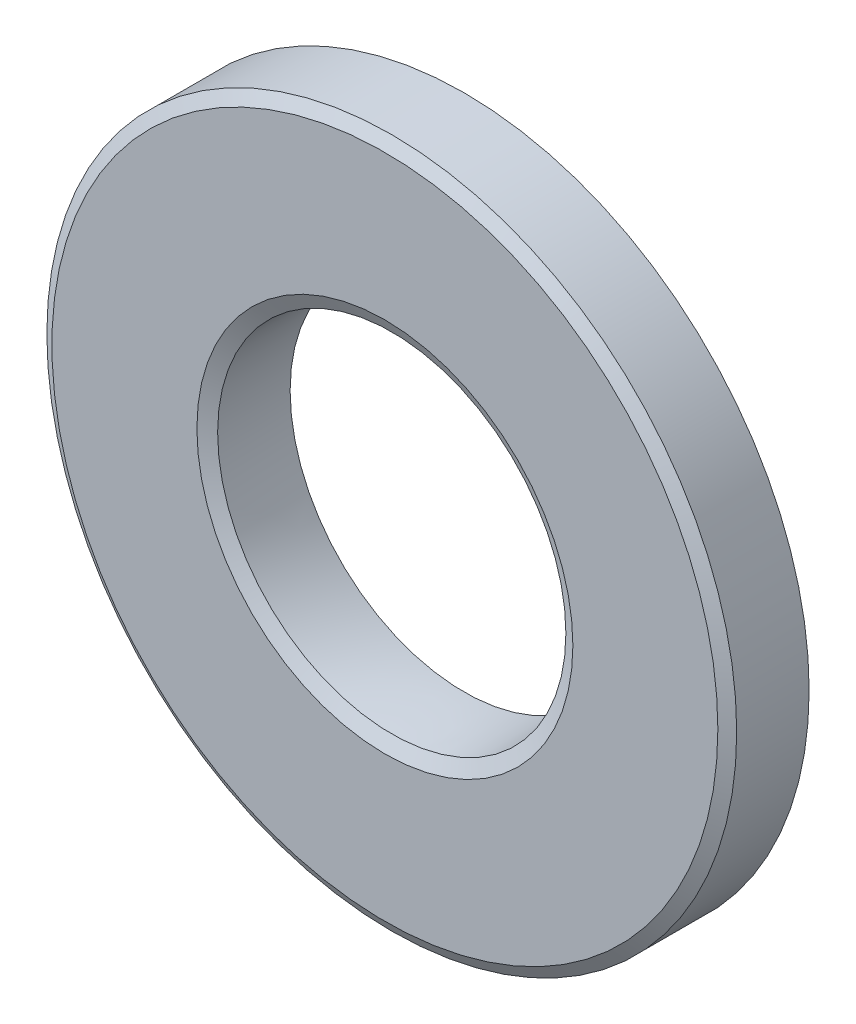
ISO-10303-21;
HEADER;
FILE_DESCRIPTION(('STEP AP214'),'2;1');
FILE_NAME('part.step','',(''),(''),'','','');
FILE_SCHEMA(('AUTOMOTIVE_DESIGN { 1 0 10303 214 1 1 1 1 }'));
ENDSEC;
DATA;
#1=APPLICATION_CONTEXT('core data for automotive mechanical design processes');
#2=APPLICATION_PROTOCOL_DEFINITION('international standard','automotive_design',2000,#1);
#3=PRODUCT_CONTEXT('',#1,'mechanical');
#4=PRODUCT('Part','Part','',(#3));
#5=PRODUCT_RELATED_PRODUCT_CATEGORY('part','',(#4));
#6=PRODUCT_DEFINITION_FORMATION('','',#4);
#7=PRODUCT_DEFINITION_CONTEXT('part definition',#1,'design');
#8=PRODUCT_DEFINITION('design','',#6,#7);
#9=PRODUCT_DEFINITION_SHAPE('','',#8);
#10=(LENGTH_UNIT() NAMED_UNIT(*) SI_UNIT(.MILLI.,.METRE.));
#11=(NAMED_UNIT(*) PLANE_ANGLE_UNIT() SI_UNIT($,.RADIAN.));
#12=(NAMED_UNIT(*) SI_UNIT($,.STERADIAN.) SOLID_ANGLE_UNIT());
#13=UNCERTAINTY_MEASURE_WITH_UNIT(LENGTH_MEASURE(1.E-05),#10,'distance_accuracy_value','');
#14=(GEOMETRIC_REPRESENTATION_CONTEXT(3) GLOBAL_UNCERTAINTY_ASSIGNED_CONTEXT((#13)) GLOBAL_UNIT_ASSIGNED_CONTEXT((#10,
#11,#12)) REPRESENTATION_CONTEXT('',''));
#15=CARTESIAN_POINT('',(0.,0.,0.));
#16=DIRECTION('',(0.,0.,1.));
#17=DIRECTION('',(1.,0.,0.));
#18=AXIS2_PLACEMENT_3D('',#15,#16,#17);
#19=CARTESIAN_POINT('',(0.,0.,1.5875));
#20=DIRECTION('',(0.,0.,1.));
#21=DIRECTION('',(1.,0.,0.));
#22=AXIS2_PLACEMENT_3D('',#19,#20,#21);
#23=PLANE('',#22);
#24=CARTESIAN_POINT('',(0.,0.,1.5875));
#25=DIRECTION('',(0.,0.,1.));
#26=DIRECTION('',(1.,0.,0.));
#27=AXIS2_PLACEMENT_3D('',#24,#25,#26);
#28=CIRCLE('',#27,6.92206660595213);
#29=CARTESIAN_POINT('',(6.92206660595213,0.,1.5875));
#30=VERTEX_POINT('',#29);
#31=EDGE_CURVE('E10',#30,#30,#28,.F.);
#32=ORIENTED_EDGE('',*,*,#31,.T.);
#33=EDGE_LOOP('',(#32));
#34=FACE_BOUND('',#33,.T.);
#35=CARTESIAN_POINT('',(0.,0.,1.5875));
#36=DIRECTION('',(0.,0.,1.));
#37=DIRECTION('',(1.,0.,0.));
#38=AXIS2_PLACEMENT_3D('',#35,#36,#37);
#39=CIRCLE('',#38,12.2600590948775);
#40=CARTESIAN_POINT('',(12.2600590948775,0.,1.5875));
#41=VERTEX_POINT('',#40);
#42=EDGE_CURVE('E56',#41,#41,#39,.T.);
#43=ORIENTED_EDGE('',*,*,#42,.T.);
#44=EDGE_LOOP('',(#43));
#45=FACE_BOUND('',#44,.T.);
#46=ADVANCED_FACE('F39',(#34,#45),#23,.T.);
#47=CARTESIAN_POINT('',(0.,0.,1.5875));
#48=DIRECTION('',(0.,0.,-1.));
#49=DIRECTION('',(-1.,0.,0.));
#50=AXIS2_PLACEMENT_3D('',#47,#48,#49);
#51=CYLINDRICAL_SURFACE('',#50,12.7);
#52=CARTESIAN_POINT('',(0.,0.,-1.33350000000001));
#53=DIRECTION('',(0.,0.,1.));
#54=DIRECTION('',(1.,0.,0.));
#55=AXIS2_PLACEMENT_3D('',#52,#53,#54);
#56=CIRCLE('',#55,12.7);
#57=CARTESIAN_POINT('',(12.7,0.,-1.33350000000001));
#58=VERTEX_POINT('',#57);
#59=EDGE_CURVE('E63',#58,#58,#56,.T.);
#60=ORIENTED_EDGE('',*,*,#59,.T.);
#61=EDGE_LOOP('',(#60));
#62=FACE_BOUND('',#61,.T.);
#63=CARTESIAN_POINT('',(0.,0.,1.33349999999999));
#64=DIRECTION('',(0.,0.,1.));
#65=DIRECTION('',(1.,0.,0.));
#66=AXIS2_PLACEMENT_3D('',#63,#64,#65);
#67=CIRCLE('',#66,12.7);
#68=CARTESIAN_POINT('',(12.7,0.,1.33349999999999));
#69=VERTEX_POINT('',#68);
#70=EDGE_CURVE('E67',#69,#69,#67,.F.);
#71=ORIENTED_EDGE('',*,*,#70,.T.);
#72=EDGE_LOOP('',(#71));
#73=FACE_BOUND('',#72,.T.);
#74=ADVANCED_FACE('F74',(#62,#73),#51,.T.);
#75=CARTESIAN_POINT('',(0.,0.,-1.5875));
#76=DIRECTION('',(0.,0.,1.));
#77=DIRECTION('',(1.,0.,0.));
#78=AXIS2_PLACEMENT_3D('',#75,#76,#77);
#79=PLANE('',#78);
#80=CARTESIAN_POINT('',(0.,0.,-1.5875));
#81=DIRECTION('',(0.,0.,1.));
#82=DIRECTION('',(1.,0.,0.));
#83=AXIS2_PLACEMENT_3D('',#80,#81,#82);
#84=CIRCLE('',#83,6.92206660595213);
#85=CARTESIAN_POINT('',(-6.92206660595213,0.,-1.58750000000001));
#86=VERTEX_POINT('',#85);
#87=EDGE_CURVE('E53',#86,#86,#84,.T.);
#88=ORIENTED_EDGE('',*,*,#87,.T.);
#89=EDGE_LOOP('',(#88));
#90=FACE_BOUND('',#89,.T.);
#91=CARTESIAN_POINT('',(0.,0.,-1.5875));
#92=DIRECTION('',(0.,0.,1.));
#93=DIRECTION('',(1.,0.,0.));
#94=AXIS2_PLACEMENT_3D('',#91,#92,#93);
#95=CIRCLE('',#94,12.2600590948775);
#96=CARTESIAN_POINT('',(12.2600590948775,0.,-1.5875));
#97=VERTEX_POINT('',#96);
#98=EDGE_CURVE('E65',#97,#97,#95,.F.);
#99=ORIENTED_EDGE('',*,*,#98,.T.);
#100=EDGE_LOOP('',(#99));
#101=FACE_BOUND('',#100,.T.);
#102=ADVANCED_FACE('F87',(#90,#101),#79,.F.);
#103=CARTESIAN_POINT('',(0.,0.,-1.33350000000001));
#104=DIRECTION('',(0.,0.,1.));
#105=DIRECTION('',(1.,0.,0.));
#106=AXIS2_PLACEMENT_3D('',#103,#104,#105);
#107=CONICAL_SURFACE('',#106,12.7,1.04719755119659);
#108=ORIENTED_EDGE('',*,*,#98,.F.);
#109=EDGE_LOOP('',(#108));
#110=FACE_BOUND('',#109,.T.);
#111=ORIENTED_EDGE('',*,*,#59,.F.);
#112=EDGE_LOOP('',(#111));
#113=FACE_BOUND('',#112,.T.);
#114=ADVANCED_FACE('F76',(#110,#113),#107,.T.);
#115=CARTESIAN_POINT('',(0.,0.,1.5875));
#116=DIRECTION('',(0.,0.,-1.));
#117=DIRECTION('',(-1.,0.,0.));
#118=AXIS2_PLACEMENT_3D('',#115,#116,#117);
#119=CONICAL_SURFACE('',#118,12.2600590948775,1.04719755119659);
#120=ORIENTED_EDGE('',*,*,#70,.F.);
#121=EDGE_LOOP('',(#120));
#122=FACE_BOUND('',#121,.T.);
#123=ORIENTED_EDGE('',*,*,#42,.F.);
#124=EDGE_LOOP('',(#123));
#125=FACE_BOUND('',#124,.T.);
#126=ADVANCED_FACE('F75',(#122,#125),#119,.T.);
#127=CARTESIAN_POINT('',(0.,0.,0.));
#128=DIRECTION('',(0.,0.,1.));
#129=DIRECTION('',(0.,-1.,0.));
#130=AXIS2_PLACEMENT_3D('',#127,#128,#129);
#131=TOROIDAL_SURFACE('',#130,31.2054874999997,24.8300874999997);
#132=CARTESIAN_POINT('',(0.,0.,-1.33468124480382));
#133=DIRECTION('',(0.,0.,1.));
#134=DIRECTION('',(1.,0.,0.));
#135=AXIS2_PLACEMENT_3D('',#132,#133,#134);
#136=CIRCLE('',#135,6.41129722823623);
#137=CARTESIAN_POINT('',(-6.41129722823623,0.,-1.33468124480382));
#138=VERTEX_POINT('',#137);
#139=EDGE_CURVE('E46',#138,#138,#136,.F.);
#140=ORIENTED_EDGE('',*,*,#139,.T.);
#141=EDGE_LOOP('',(#140));
#142=FACE_BOUND('',#141,.T.);
#143=CARTESIAN_POINT('',(0.,0.,1.33468124480381));
#144=DIRECTION('',(0.,0.,-1.));
#145=DIRECTION('',(-1.,0.,0.));
#146=AXIS2_PLACEMENT_3D('',#143,#144,#145);
#147=CIRCLE('',#146,6.41129722823623);
#148=CARTESIAN_POINT('',(-6.41129722823623,0.,1.33468124480381));
#149=VERTEX_POINT('',#148);
#150=EDGE_CURVE('E49',#149,#149,#147,.F.);
#151=ORIENTED_EDGE('',*,*,#150,.T.);
#152=EDGE_LOOP('',(#151));
#153=FACE_BOUND('',#152,.T.);
#154=ADVANCED_FACE('F80',(#142,#153),#131,.T.);
#155=CARTESIAN_POINT('',(0.,0.,-1.5875));
#156=DIRECTION('',(0.,0.,-1.));
#157=DIRECTION('',(-1.,0.,0.));
#158=AXIS2_PLACEMENT_3D('',#155,#156,#157);
#159=CONICAL_SURFACE('',#158,6.92206660595213,1.11117571927522);
#160=CARTESIAN_POINT('',(-6.41129722823623,0.,-1.33468124480382));
#161=CARTESIAN_POINT('',(-6.41661774258743,0.,-1.33731477350378));
#162=CARTESIAN_POINT('',(-6.42193825693864,0.,-1.33994830220374));
#163=CARTESIAN_POINT('',(-6.43257928564106,0.,-1.34521535960366));
#164=CARTESIAN_POINT('',(-6.43789979999226,0.,-1.34784888830362));
#165=CARTESIAN_POINT('',(-6.44854082869468,0.,-1.35311594570354));
#166=CARTESIAN_POINT('',(-6.45386134304589,0.,-1.3557494744035));
#167=CARTESIAN_POINT('',(-6.4645023717483,0.,-1.36101653180342));
#168=CARTESIAN_POINT('',(-6.46982288609951,0.,-1.36365006050339));
#169=CARTESIAN_POINT('',(-6.48046391480192,0.,-1.36891711790331));
#170=CARTESIAN_POINT('',(-6.48578442915313,0.,-1.37155064660327));
#171=CARTESIAN_POINT('',(-6.49642545785554,0.,-1.37681770400319));
#172=CARTESIAN_POINT('',(-6.50174597220675,0.,-1.37945123270315));
#173=CARTESIAN_POINT('',(-6.51238700090917,0.,-1.38471829010307));
#174=CARTESIAN_POINT('',(-6.51770751526038,0.,-1.38735181880303));
#175=CARTESIAN_POINT('',(-6.52834854396279,0.,-1.39261887620295));
#176=CARTESIAN_POINT('',(-6.533669058314,0.,-1.39525240490291));
#177=CARTESIAN_POINT('',(-6.54431008701641,0.,-1.40051946230283));
#178=CARTESIAN_POINT('',(-6.54963060136762,0.,-1.40315299100279));
#179=CARTESIAN_POINT('',(-6.56027163007003,0.,-1.40842004840271));
#180=CARTESIAN_POINT('',(-6.56559214442124,0.,-1.41105357710267));
#181=CARTESIAN_POINT('',(-6.57623317312366,0.,-1.41632063450259));
#182=CARTESIAN_POINT('',(-6.58155368747486,0.,-1.41895416320255));
#183=CARTESIAN_POINT('',(-6.59219471617728,0.,-1.42422122060247));
#184=CARTESIAN_POINT('',(-6.59751523052848,0.,-1.42685474930243));
#185=CARTESIAN_POINT('',(-6.6081562592309,0.,-1.43212180670235));
#186=CARTESIAN_POINT('',(-6.61347677358211,0.,-1.43475533540231));
#187=CARTESIAN_POINT('',(-6.62411780228452,0.,-1.44002239280223));
#188=CARTESIAN_POINT('',(-6.62943831663573,0.,-1.44265592150219));
#189=CARTESIAN_POINT('',(-6.64007934533814,0.,-1.44792297890211));
#190=CARTESIAN_POINT('',(-6.64539985968935,0.,-1.45055650760207));
#191=CARTESIAN_POINT('',(-6.65604088839177,0.,-1.45582356500199));
#192=CARTESIAN_POINT('',(-6.66136140274297,0.,-1.45845709370195));
#193=CARTESIAN_POINT('',(-6.67200243144539,0.,-1.46372415110187));
#194=CARTESIAN_POINT('',(-6.6773229457966,0.,-1.46635767980183));
#195=CARTESIAN_POINT('',(-6.68796397449901,0.,-1.47162473720175));
#196=CARTESIAN_POINT('',(-6.69328448885022,0.,-1.47425826590171));
#197=CARTESIAN_POINT('',(-6.70392551755263,0.,-1.47952532330164));
#198=CARTESIAN_POINT('',(-6.70924603190384,0.,-1.4821588520016));
#199=CARTESIAN_POINT('',(-6.71988706060625,0.,-1.48742590940152));
#200=CARTESIAN_POINT('',(-6.72520757495746,0.,-1.49005943810148));
#201=CARTESIAN_POINT('',(-6.73584860365988,0.,-1.4953264955014));
#202=CARTESIAN_POINT('',(-6.74116911801108,0.,-1.49796002420136));
#203=CARTESIAN_POINT('',(-6.7518101467135,0.,-1.50322708160128));
#204=CARTESIAN_POINT('',(-6.75713066106471,0.,-1.50586061030124));
#205=CARTESIAN_POINT('',(-6.76777168976712,0.,-1.51112766770116));
#206=CARTESIAN_POINT('',(-6.77309220411833,0.,-1.51376119640112));
#207=CARTESIAN_POINT('',(-6.78373323282074,0.,-1.51902825380104));
#208=CARTESIAN_POINT('',(-6.78905374717195,0.,-1.521661782501));
#209=CARTESIAN_POINT('',(-6.79969477587436,0.,-1.52692883990092));
#210=CARTESIAN_POINT('',(-6.80501529022557,0.,-1.52956236860088));
#211=CARTESIAN_POINT('',(-6.81565631892799,0.,-1.5348294260008));
#212=CARTESIAN_POINT('',(-6.82097683327919,0.,-1.53746295470076));
#213=CARTESIAN_POINT('',(-6.83161786198161,0.,-1.54273001210068));
#214=CARTESIAN_POINT('',(-6.83693837633282,0.,-1.54536354080064));
#215=CARTESIAN_POINT('',(-6.84757940503523,0.,-1.55063059820056));
#216=CARTESIAN_POINT('',(-6.85289991938644,0.,-1.55326412690052));
#217=CARTESIAN_POINT('',(-6.86354094808885,0.,-1.55853118430044));
#218=CARTESIAN_POINT('',(-6.86886146244006,0.,-1.5611647130004));
#219=CARTESIAN_POINT('',(-6.87950249114247,0.,-1.56643177040032));
#220=CARTESIAN_POINT('',(-6.88482300549368,0.,-1.56906529910028));
#221=CARTESIAN_POINT('',(-6.8954640341961,0.,-1.5743323565002));
#222=CARTESIAN_POINT('',(-6.9007845485473,0.,-1.57696588520016));
#223=CARTESIAN_POINT('',(-6.91142557724972,0.,-1.58223294260008));
#224=CARTESIAN_POINT('',(-6.91674609160093,0.,-1.58486647130004));
#225=CARTESIAN_POINT('',(-6.92206660595213,0.,-1.5875));
#226=B_SPLINE_CURVE_WITH_KNOTS('',3,(#160,#161,#162,#163,#164,#165,#166,#167,#168,#169,#170,
#171,#172,#173,#174,#175,#176,#177,#178,#179,#180,#181,#182,#183,#184,#185,#186,#187,#188,#189,
#190,#191,#192,#193,#194,#195,#196,#197,#198,#199,#200,#201,#202,#203,#204,#205,#206,#207,#208,
#209,#210,#211,#212,#213,#214,#215,#216,#217,#218,#219,#220,#221,#222,#223,#224,#225),
.UNSPECIFIED.,.F.,.F.,(4,2,2,2,2,2,2,2,2,2,2,2,2,2,2,2,2,2,2,2,2,2,2,2,2,2,2,2,2,2,2,2,4),(0.,
0.017809832042281,0.0356196640845621,0.0534294961268431,0.0712393281691242,0.0890491602114052,
0.106858992253686,0.124668824295967,0.142478656338248,0.160288488380529,0.17809832042281,
0.195908152465091,0.213717984507372,0.231527816549653,0.249337648591934,0.267147480634215,
0.284957312676496,0.302767144718777,0.320576976761058,0.338386808803338,0.35619664084562,
0.374006472887901,0.391816304930182,0.409626136972463,0.427435969014744,0.445245801057025,
0.463055633099306,0.480865465141587,0.498675297183868,0.516485129226149,0.534294961268429,
0.55210479331071,0.569914625352992),.UNSPECIFIED.);
#227=EDGE_CURVE('BSEAM98',#138,#86,#226,.T.);
#228=ORIENTED_EDGE('',*,*,#139,.F.);
#229=ORIENTED_EDGE('',*,*,#87,.F.);
#230=ORIENTED_EDGE('',*,*,#227,.T.);
#231=ORIENTED_EDGE('',*,*,#227,.F.);
#232=EDGE_LOOP('',(#228,#230,#229,#231));
#233=FACE_BOUND('',#232,.T.);
#234=ADVANCED_FACE('F98',(#233),#159,.F.);
#235=CARTESIAN_POINT('',(0.,0.,1.33468124480381));
#236=DIRECTION('',(0.,0.,1.));
#237=DIRECTION('',(1.,0.,0.));
#238=AXIS2_PLACEMENT_3D('',#235,#236,#237);
#239=CONICAL_SURFACE('',#238,6.41129722823623,1.11117571927522);
#240=ORIENTED_EDGE('',*,*,#31,.F.);
#241=EDGE_LOOP('',(#240));
#242=FACE_BOUND('',#241,.T.);
#243=ORIENTED_EDGE('',*,*,#150,.F.);
#244=EDGE_LOOP('',(#243));
#245=FACE_BOUND('',#244,.T.);
#246=ADVANCED_FACE('F41',(#242,#245),#239,.F.);
#247=CLOSED_SHELL('',(#46,#74,#102,#114,#126,#154,#234,#246));
#248=MANIFOLD_SOLID_BREP('B2',#247);
#249=ADVANCED_BREP_SHAPE_REPRESENTATION('',(#18,#248),#14);
#250=SHAPE_DEFINITION_REPRESENTATION(#9,#249);
ENDSEC;
END-ISO-10303-21;
